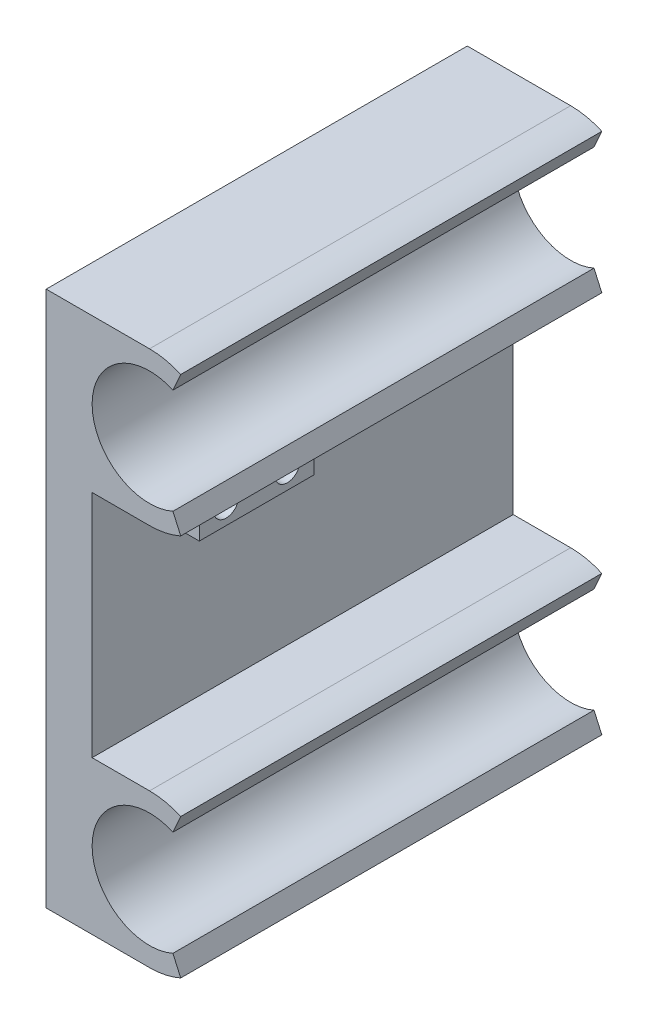
ISO-10303-21;
HEADER;
FILE_DESCRIPTION(('STEP AP214'),'2;1');
FILE_NAME('part.step','',(''),(''),'','','');
FILE_SCHEMA(('AUTOMOTIVE_DESIGN { 1 0 10303 214 1 1 1 1 }'));
ENDSEC;
DATA;
#1=APPLICATION_CONTEXT('core data for automotive mechanical design processes');
#2=APPLICATION_PROTOCOL_DEFINITION('international standard','automotive_design',2000,#1);
#3=PRODUCT_CONTEXT('',#1,'mechanical');
#4=PRODUCT('Part','Part','',(#3));
#5=PRODUCT_RELATED_PRODUCT_CATEGORY('part','',(#4));
#6=PRODUCT_DEFINITION_FORMATION('','',#4);
#7=PRODUCT_DEFINITION_CONTEXT('part definition',#1,'design');
#8=PRODUCT_DEFINITION('design','',#6,#7);
#9=PRODUCT_DEFINITION_SHAPE('','',#8);
#10=(LENGTH_UNIT() NAMED_UNIT(*) SI_UNIT(.MILLI.,.METRE.));
#11=(NAMED_UNIT(*) PLANE_ANGLE_UNIT() SI_UNIT($,.RADIAN.));
#12=(NAMED_UNIT(*) SI_UNIT($,.STERADIAN.) SOLID_ANGLE_UNIT());
#13=UNCERTAINTY_MEASURE_WITH_UNIT(LENGTH_MEASURE(1.E-05),#10,'distance_accuracy_value','');
#14=(GEOMETRIC_REPRESENTATION_CONTEXT(3) GLOBAL_UNCERTAINTY_ASSIGNED_CONTEXT((#13)) GLOBAL_UNIT_ASSIGNED_CONTEXT((#10,
#11,#12)) REPRESENTATION_CONTEXT('',''));
#15=CARTESIAN_POINT('',(0.,0.,0.));
#16=DIRECTION('',(0.,0.,1.));
#17=DIRECTION('',(1.,0.,0.));
#18=AXIS2_PLACEMENT_3D('',#15,#16,#17);
#19=CARTESIAN_POINT('',(6.,-15.,55.));
#20=DIRECTION('',(-1.,0.,0.));
#21=DIRECTION('',(0.,0.,1.));
#22=AXIS2_PLACEMENT_3D('',#19,#20,#21);
#23=PLANE('',#22);
#24=DIRECTION('',(0.,0.,-1.));
#25=VECTOR('',#24,1.);
#26=CARTESIAN_POINT('',(6.,15.,55.));
#27=LINE('',#26,#25);
#28=CARTESIAN_POINT('',(6.,15.,41.15));
#29=VERTEX_POINT('',#28);
#30=CARTESIAN_POINT('',(6.,15.,37.85));
#31=VERTEX_POINT('',#30);
#32=EDGE_CURVE('E462',#29,#31,#27,.T.);
#33=ORIENTED_EDGE('',*,*,#32,.F.);
#34=CARTESIAN_POINT('',(6.,15.,39.5));
#35=DIRECTION('',(1.,0.,0.));
#36=DIRECTION('',(0.,0.,-1.));
#37=AXIS2_PLACEMENT_3D('',#34,#35,#36);
#38=CIRCLE('',#37,1.65);
#39=EDGE_CURVE('E451',#29,#31,#38,.T.);
#40=ORIENTED_EDGE('',*,*,#39,.T.);
#41=EDGE_LOOP('',(#33,#40));
#42=FACE_BOUND('',#41,.T.);
#43=ADVANCED_FACE('F32',(#42),#23,.F.);
#44=CARTESIAN_POINT('',(6.,15.,49.15));
#45=VERTEX_POINT('',#44);
#46=CARTESIAN_POINT('',(6.,15.,45.85));
#47=VERTEX_POINT('',#46);
#48=EDGE_CURVE('E233',#45,#47,#27,.T.);
#49=ORIENTED_EDGE('',*,*,#48,.F.);
#50=CARTESIAN_POINT('',(6.,15.,47.5));
#51=DIRECTION('',(1.,0.,0.));
#52=DIRECTION('',(0.,0.,-1.));
#53=AXIS2_PLACEMENT_3D('',#50,#51,#52);
#54=CIRCLE('',#53,1.65);
#55=EDGE_CURVE('E475',#45,#47,#54,.T.);
#56=ORIENTED_EDGE('',*,*,#55,.T.);
#57=EDGE_LOOP('',(#49,#56));
#58=FACE_BOUND('',#57,.T.);
#59=ADVANCED_FACE('F474',(#58),#23,.F.);
#60=CARTESIAN_POINT('',(13.5,15.,55.));
#61=DIRECTION('',(0.,1.,0.));
#62=DIRECTION('',(-1.,0.,0.));
#63=AXIS2_PLACEMENT_3D('',#60,#61,#62);
#64=PLANE('',#63);
#65=DIRECTION('',(-1.,0.,0.));
#66=VECTOR('',#65,1.);
#67=CARTESIAN_POINT('',(13.5,15.,51.));
#68=LINE('',#67,#66);
#69=CARTESIAN_POINT('',(13.5,15.,51.));
#70=VERTEX_POINT('',#69);
#71=CARTESIAN_POINT('',(6.,15.,51.));
#72=VERTEX_POINT('',#71);
#73=EDGE_CURVE('E178',#70,#72,#68,.T.);
#74=ORIENTED_EDGE('',*,*,#73,.F.);
#75=DIRECTION('',(0.,0.,-1.));
#76=VECTOR('',#75,1.);
#77=CARTESIAN_POINT('',(13.5,15.,55.));
#78=LINE('',#77,#76);
#79=CARTESIAN_POINT('',(13.5,15.,55.));
#80=VERTEX_POINT('',#79);
#81=EDGE_CURVE('E175',#80,#70,#78,.T.);
#82=ORIENTED_EDGE('',*,*,#81,.F.);
#83=DIRECTION('',(1.,0.,0.));
#84=VECTOR('',#83,1.);
#85=CARTESIAN_POINT('',(13.5,15.,55.));
#86=LINE('',#85,#84);
#87=CARTESIAN_POINT('',(6.,15.,55.));
#88=VERTEX_POINT('',#87);
#89=EDGE_CURVE('E161',#88,#80,#86,.T.);
#90=ORIENTED_EDGE('',*,*,#89,.F.);
#91=EDGE_CURVE('E230',#88,#72,#27,.T.);
#92=ORIENTED_EDGE('',*,*,#91,.T.);
#93=EDGE_LOOP('',(#74,#82,#90,#92));
#94=FACE_BOUND('',#93,.T.);
#95=ADVANCED_FACE('F176',(#94),#64,.F.);
#96=DIRECTION('',(1.,0.,0.));
#97=VECTOR('',#96,1.);
#98=CARTESIAN_POINT('',(13.5,15.,36.));
#99=LINE('',#98,#97);
#100=CARTESIAN_POINT('',(6.,15.,36.));
#101=VERTEX_POINT('',#100);
#102=CARTESIAN_POINT('',(13.5,15.,36.));
#103=VERTEX_POINT('',#102);
#104=EDGE_CURVE('E412',#101,#103,#99,.T.);
#105=ORIENTED_EDGE('',*,*,#104,.F.);
#106=CARTESIAN_POINT('',(6.,15.,0.));
#107=VERTEX_POINT('',#106);
#108=EDGE_CURVE('E181',#101,#107,#27,.T.);
#109=ORIENTED_EDGE('',*,*,#108,.T.);
#110=DIRECTION('',(1.,0.,0.));
#111=VECTOR('',#110,1.);
#112=CARTESIAN_POINT('',(13.5,15.,0.));
#113=LINE('',#112,#111);
#114=CARTESIAN_POINT('',(13.5,15.,0.));
#115=VERTEX_POINT('',#114);
#116=EDGE_CURVE('E221',#107,#115,#113,.T.);
#117=ORIENTED_EDGE('',*,*,#116,.T.);
#118=EDGE_CURVE('E184',#103,#115,#78,.T.);
#119=ORIENTED_EDGE('',*,*,#118,.F.);
#120=EDGE_LOOP('',(#105,#109,#117,#119));
#121=FACE_BOUND('',#120,.T.);
#122=ADVANCED_FACE('F460',(#121),#64,.F.);
#123=ORIENTED_EDGE('',*,*,#32,.T.);
#124=DIRECTION('',(-1.,0.,0.));
#125=VECTOR('',#124,1.);
#126=CARTESIAN_POINT('',(16.,15.,37.85));
#127=LINE('',#126,#125);
#128=CARTESIAN_POINT('',(13.5,15.,37.85));
#129=VERTEX_POINT('',#128);
#130=EDGE_CURVE('E409',#31,#129,#127,.F.);
#131=ORIENTED_EDGE('',*,*,#130,.T.);
#132=CARTESIAN_POINT('',(13.5,15.,41.15));
#133=VERTEX_POINT('',#132);
#134=EDGE_CURVE('E486',#133,#129,#78,.T.);
#135=ORIENTED_EDGE('',*,*,#134,.F.);
#136=DIRECTION('',(-1.,0.,0.));
#137=VECTOR('',#136,1.);
#138=CARTESIAN_POINT('',(16.,15.,41.15));
#139=LINE('',#138,#137);
#140=EDGE_CURVE('E406',#133,#29,#139,.T.);
#141=ORIENTED_EDGE('',*,*,#140,.T.);
#142=EDGE_LOOP('',(#123,#131,#135,#141));
#143=FACE_BOUND('',#142,.T.);
#144=ADVANCED_FACE('F485',(#143),#64,.F.);
#145=CARTESIAN_POINT('',(13.5,25.,55.));
#146=DIRECTION('',(0.,0.,-1.));
#147=DIRECTION('',(-1.,0.,0.));
#148=AXIS2_PLACEMENT_3D('',#145,#146,#147);
#149=CYLINDRICAL_SURFACE('',#148,10.);
#150=CARTESIAN_POINT('',(13.5,25.,36.));
#151=DIRECTION('',(0.,0.,1.));
#152=DIRECTION('',(1.,0.,0.));
#153=AXIS2_PLACEMENT_3D('',#150,#151,#152);
#154=CIRCLE('',#153,10.);
#155=CARTESIAN_POINT('',(16.,15.3175416344815,36.));
#156=VERTEX_POINT('',#155);
#157=EDGE_CURVE('E11',#103,#156,#154,.T.);
#158=ORIENTED_EDGE('',*,*,#157,.F.);
#159=ORIENTED_EDGE('',*,*,#118,.T.);
#160=CARTESIAN_POINT('',(13.5,25.,0.));
#161=DIRECTION('',(0.,0.,1.));
#162=DIRECTION('',(1.,0.,0.));
#163=AXIS2_PLACEMENT_3D('',#160,#161,#162);
#164=CIRCLE('',#163,10.);
#165=CARTESIAN_POINT('',(17.5721274810868,15.8666666666667,0.));
#166=VERTEX_POINT('',#165);
#167=EDGE_CURVE('E224',#115,#166,#164,.T.);
#168=ORIENTED_EDGE('',*,*,#167,.T.);
#169=DIRECTION('',(0.,0.,-1.));
#170=VECTOR('',#169,1.);
#171=CARTESIAN_POINT('',(17.5721274810868,15.8666666666667,55.));
#172=LINE('',#171,#170);
#173=CARTESIAN_POINT('',(17.5721274810868,15.8666666666667,55.));
#174=VERTEX_POINT('',#173);
#175=EDGE_CURVE('E187',#174,#166,#172,.T.);
#176=ORIENTED_EDGE('',*,*,#175,.F.);
#177=CARTESIAN_POINT('',(13.5,25.,55.));
#178=DIRECTION('',(0.,0.,1.));
#179=DIRECTION('',(1.,0.,0.));
#180=AXIS2_PLACEMENT_3D('',#177,#178,#179);
#181=CIRCLE('',#180,10.);
#182=EDGE_CURVE('E165',#80,#174,#181,.T.);
#183=ORIENTED_EDGE('',*,*,#182,.F.);
#184=ORIENTED_EDGE('',*,*,#81,.T.);
#185=CARTESIAN_POINT('',(13.5,25.,51.));
#186=DIRECTION('',(0.,0.,-1.));
#187=DIRECTION('',(-1.,0.,0.));
#188=AXIS2_PLACEMENT_3D('',#185,#186,#187);
#189=CIRCLE('',#188,10.);
#190=CARTESIAN_POINT('',(16.,15.3175416344815,51.));
#191=VERTEX_POINT('',#190);
#192=EDGE_CURVE('E299',#191,#70,#189,.T.);
#193=ORIENTED_EDGE('',*,*,#192,.F.);
#194=DIRECTION('',(0.,0.,-1.));
#195=VECTOR('',#194,1.);
#196=CARTESIAN_POINT('',(16.,15.3175416344815,55.));
#197=LINE('',#196,#195);
#198=CARTESIAN_POINT('',(16.,15.3175416344815,49.1191563576044));
#199=VERTEX_POINT('',#198);
#200=EDGE_CURVE('E276',#199,#191,#197,.F.);
#201=ORIENTED_EDGE('',*,*,#200,.F.);
#202=CARTESIAN_POINT('',(16.,15.3175416344815,49.1191563576044));
#203=CARTESIAN_POINT('',(15.8979421307727,15.2911890542514,49.124310786379));
#204=CARTESIAN_POINT('',(15.795428287766,15.2664425788042,49.1285095422768));
#205=CARTESIAN_POINT('',(15.589630059372,15.2201962731603,49.135411814873));
#206=CARTESIAN_POINT('',(15.4863457474233,15.1986961375799,49.1381154722793));
#207=CARTESIAN_POINT('',(15.2795529573279,15.1590533011292,49.142435605293));
#208=CARTESIAN_POINT('',(15.1760471286741,15.1408972134226,49.1440564871295));
#209=CARTESIAN_POINT('',(14.9685037598624,15.1078547321028,49.1465547736602));
#210=CARTESIAN_POINT('',(14.8644662064941,15.0929684201337,49.1474321597914));
#211=CARTESIAN_POINT('',(14.6559752365499,15.0664828240433,49.1487133619864));
#212=CARTESIAN_POINT('',(14.5515218366008,15.054883409814,49.1491171967972));
#213=CARTESIAN_POINT('',(14.342301705926,15.0349826782866,49.1496589529621));
#214=CARTESIAN_POINT('',(14.2375349779505,15.0266813321254,49.1497968766433));
#215=CARTESIAN_POINT('',(14.0273608233567,15.0133577763454,49.1499602200339));
#216=CARTESIAN_POINT('',(13.9219525331465,15.0083491834372,49.1499851750482));
#217=CARTESIAN_POINT('',(13.7110294926947,15.0016699822797,49.1499996152529));
#218=CARTESIAN_POINT('',(13.6055147416964,14.9999993979307,49.1499891001893));
#219=CARTESIAN_POINT('',(13.5,15.,49.15));
#220=B_SPLINE_CURVE_WITH_KNOTS('',3,(#202,#203,#204,#205,#206,#207,#208,#209,#210,#211,#212,
#213,#214,#215,#216,#217,#218,#219),.UNSPECIFIED.,.F.,.F.,(4,2,2,2,2,2,2,2,4),(0.,
0.316566485829993,0.63310317361785,0.948343775264132,1.26359224735279,1.57882823894681,
1.89406147167617,2.2105902406735,2.52712127602648),.UNSPECIFIED.);
#221=CARTESIAN_POINT('',(13.5,15.,49.15));
#222=VERTEX_POINT('',#221);
#223=EDGE_CURVE('E268',#199,#222,#220,.T.);
#224=ORIENTED_EDGE('',*,*,#223,.T.);
#225=CARTESIAN_POINT('',(13.5,15.,45.85));
#226=VERTEX_POINT('',#225);
#227=EDGE_CURVE('E182',#222,#226,#78,.T.);
#228=ORIENTED_EDGE('',*,*,#227,.T.);
#229=CARTESIAN_POINT('',(13.5,15.,45.85));
#230=CARTESIAN_POINT('',(13.6055147416964,14.9999993979307,45.8500108998107));
#231=CARTESIAN_POINT('',(13.7110294926947,15.0016699822797,45.8500003847472));
#232=CARTESIAN_POINT('',(13.9219525331465,15.0083491834372,45.8500148249519));
#233=CARTESIAN_POINT('',(14.0273608233567,15.0133577763454,45.8500397799661));
#234=CARTESIAN_POINT('',(14.2375349779505,15.0266813321254,45.8502031233567));
#235=CARTESIAN_POINT('',(14.342301705926,15.0349826782866,45.8503410470379));
#236=CARTESIAN_POINT('',(14.5515218366008,15.054883409814,45.8508828032028));
#237=CARTESIAN_POINT('',(14.6559752365499,15.0664828240433,45.8512866380136));
#238=CARTESIAN_POINT('',(14.8644662064941,15.0929684201337,45.8525678402087));
#239=CARTESIAN_POINT('',(14.9685037598624,15.1078547321028,45.8534452263399));
#240=CARTESIAN_POINT('',(15.1760471286741,15.1408972134226,45.8559435128705));
#241=CARTESIAN_POINT('',(15.2795529573279,15.1590533011292,45.857564394707));
#242=CARTESIAN_POINT('',(15.4863457474233,15.1986961375799,45.8618845277208));
#243=CARTESIAN_POINT('',(15.589630059372,15.2201962731603,45.864588185127));
#244=CARTESIAN_POINT('',(15.795428287766,15.2664425788042,45.8714904577232));
#245=CARTESIAN_POINT('',(15.8979421307727,15.2911890542514,45.875689213621));
#246=CARTESIAN_POINT('',(16.,15.3175416344815,45.8808436423956));
#247=B_SPLINE_CURVE_WITH_KNOTS('',3,(#229,#230,#231,#232,#233,#234,#235,#236,#237,#238,#239,
#240,#241,#242,#243,#244,#245,#246),.UNSPECIFIED.,.F.,.F.,(4,2,2,2,2,2,2,2,4),(0.,
0.316531035352973,0.633059804350308,0.948293037079668,1.26352902867369,1.57877750076235,
1.89401810240863,2.21055479019649,2.52712127602648),.UNSPECIFIED.);
#248=CARTESIAN_POINT('',(16.,15.3175416344815,45.8808436423956));
#249=VERTEX_POINT('',#248);
#250=EDGE_CURVE('E291',#226,#249,#247,.T.);
#251=ORIENTED_EDGE('',*,*,#250,.T.);
#252=CARTESIAN_POINT('',(16.,15.3175416344815,41.1191563576044));
#253=VERTEX_POINT('',#252);
#254=EDGE_CURVE('E298',#253,#249,#197,.F.);
#255=ORIENTED_EDGE('',*,*,#254,.F.);
#256=CARTESIAN_POINT('',(16.,15.3175416344815,41.1191563576044));
#257=CARTESIAN_POINT('',(15.8979421307727,15.2911890542514,41.124310786379));
#258=CARTESIAN_POINT('',(15.795428287766,15.2664425788042,41.1285095422768));
#259=CARTESIAN_POINT('',(15.589630059372,15.2201962731603,41.135411814873));
#260=CARTESIAN_POINT('',(15.4863457474233,15.1986961375799,41.1381154722793));
#261=CARTESIAN_POINT('',(15.2795529573279,15.1590533011292,41.142435605293));
#262=CARTESIAN_POINT('',(15.1760471286741,15.1408972134226,41.1440564871295));
#263=CARTESIAN_POINT('',(14.9685037598624,15.1078547321028,41.1465547736602));
#264=CARTESIAN_POINT('',(14.8644662064941,15.0929684201337,41.1474321597914));
#265=CARTESIAN_POINT('',(14.6559752365499,15.0664828240433,41.1487133619864));
#266=CARTESIAN_POINT('',(14.5515218366008,15.054883409814,41.1491171967972));
#267=CARTESIAN_POINT('',(14.342301705926,15.0349826782866,41.1496589529621));
#268=CARTESIAN_POINT('',(14.2375349779505,15.0266813321254,41.1497968766433));
#269=CARTESIAN_POINT('',(14.0273608233567,15.0133577763454,41.1499602200339));
#270=CARTESIAN_POINT('',(13.9219525331465,15.0083491834372,41.1499851750482));
#271=CARTESIAN_POINT('',(13.7110294926947,15.0016699822797,41.1499996152529));
#272=CARTESIAN_POINT('',(13.6055147416964,14.9999993979307,41.1499891001893));
#273=CARTESIAN_POINT('',(13.5,15.,41.15));
#274=B_SPLINE_CURVE_WITH_KNOTS('',3,(#256,#257,#258,#259,#260,#261,#262,#263,#264,#265,#266,
#267,#268,#269,#270,#271,#272,#273),.UNSPECIFIED.,.F.,.F.,(4,2,2,2,2,2,2,2,4),(0.,
0.316566485829993,0.633103173617851,0.948343775264132,1.26359224735279,1.57882823894681,
1.89406147167617,2.2105902406735,2.52712127602648),.UNSPECIFIED.);
#275=EDGE_CURVE('E300',#253,#133,#274,.T.);
#276=ORIENTED_EDGE('',*,*,#275,.T.);
#277=ORIENTED_EDGE('',*,*,#134,.T.);
#278=CARTESIAN_POINT('',(13.5,15.,37.85));
#279=CARTESIAN_POINT('',(13.6055147416964,14.9999993979307,37.8500108998107));
#280=CARTESIAN_POINT('',(13.7110294926947,15.0016699822797,37.8500003847472));
#281=CARTESIAN_POINT('',(13.9219525331465,15.0083491834372,37.8500148249519));
#282=CARTESIAN_POINT('',(14.0273608233567,15.0133577763454,37.8500397799661));
#283=CARTESIAN_POINT('',(14.2375349779505,15.0266813321254,37.8502031233567));
#284=CARTESIAN_POINT('',(14.342301705926,15.0349826782866,37.8503410470379));
#285=CARTESIAN_POINT('',(14.5515218366008,15.054883409814,37.8508828032028));
#286=CARTESIAN_POINT('',(14.6559752365499,15.0664828240433,37.8512866380136));
#287=CARTESIAN_POINT('',(14.8644662064941,15.0929684201337,37.8525678402087));
#288=CARTESIAN_POINT('',(14.9685037598624,15.1078547321028,37.8534452263399));
#289=CARTESIAN_POINT('',(15.1760471286741,15.1408972134226,37.8559435128705));
#290=CARTESIAN_POINT('',(15.2795529573279,15.1590533011292,37.857564394707));
#291=CARTESIAN_POINT('',(15.4863457474233,15.1986961375799,37.8618845277208));
#292=CARTESIAN_POINT('',(15.589630059372,15.2201962731603,37.864588185127));
#293=CARTESIAN_POINT('',(15.795428287766,15.2664425788042,37.8714904577232));
#294=CARTESIAN_POINT('',(15.8979421307727,15.2911890542514,37.8756892136211));
#295=CARTESIAN_POINT('',(16.,15.3175416344815,37.8808436423956));
#296=B_SPLINE_CURVE_WITH_KNOTS('',3,(#278,#279,#280,#281,#282,#283,#284,#285,#286,#287,#288,
#289,#290,#291,#292,#293,#294,#295),.UNSPECIFIED.,.F.,.F.,(4,2,2,2,2,2,2,2,4),(0.,
0.316531035352973,0.633059804350308,0.948293037079668,1.26352902867369,1.57877750076235,
1.89401810240863,2.21055479019649,2.52712127602648),.UNSPECIFIED.);
#297=CARTESIAN_POINT('',(16.,15.3175416344815,37.8808436423956));
#298=VERTEX_POINT('',#297);
#299=EDGE_CURVE('E306',#129,#298,#296,.T.);
#300=ORIENTED_EDGE('',*,*,#299,.T.);
#301=EDGE_CURVE('E40',#156,#298,#197,.F.);
#302=ORIENTED_EDGE('',*,*,#301,.F.);
#303=EDGE_LOOP('',(#158,#159,#168,#176,#183,#184,#193,#201,#224,#228,#251,#255,#276,#277,#300,#302));
#304=FACE_BOUND('',#303,.T.);
#305=ADVANCED_FACE('F186',(#304),#149,.T.);
#306=CARTESIAN_POINT('',(13.5,25.,55.));
#307=DIRECTION('',(0.,0.,-1.));
#308=DIRECTION('',(-1.,0.,0.));
#309=AXIS2_PLACEMENT_3D('',#306,#307,#308);
#310=CYLINDRICAL_SURFACE('',#309,7.5);
#311=CARTESIAN_POINT('',(13.5,25.,0.));
#312=DIRECTION('',(0.,0.,-1.));
#313=DIRECTION('',(1.,0.,0.));
#314=AXIS2_PLACEMENT_3D('',#311,#312,#313);
#315=CIRCLE('',#314,7.5);
#316=CARTESIAN_POINT('',(16.5540956108151,18.15,0.));
#317=VERTEX_POINT('',#316);
#318=CARTESIAN_POINT('',(16.5540956108151,31.85,0.));
#319=VERTEX_POINT('',#318);
#320=EDGE_CURVE('E193',#317,#319,#315,.T.);
#321=ORIENTED_EDGE('',*,*,#320,.T.);
#322=DIRECTION('',(0.,0.,-1.));
#323=VECTOR('',#322,1.);
#324=CARTESIAN_POINT('',(16.5540956108151,31.85,55.));
#325=LINE('',#324,#323);
#326=CARTESIAN_POINT('',(16.5540956108151,31.85,55.));
#327=VERTEX_POINT('',#326);
#328=EDGE_CURVE('E266',#327,#319,#325,.T.);
#329=ORIENTED_EDGE('',*,*,#328,.F.);
#330=CARTESIAN_POINT('',(13.5,25.,55.));
#331=DIRECTION('',(0.,0.,-1.));
#332=DIRECTION('',(1.,0.,0.));
#333=AXIS2_PLACEMENT_3D('',#330,#331,#332);
#334=CIRCLE('',#333,7.5);
#335=CARTESIAN_POINT('',(16.5540956108151,18.15,55.));
#336=VERTEX_POINT('',#335);
#337=EDGE_CURVE('E227',#336,#327,#334,.T.);
#338=ORIENTED_EDGE('',*,*,#337,.F.);
#339=DIRECTION('',(0.,0.,-1.));
#340=VECTOR('',#339,1.);
#341=CARTESIAN_POINT('',(16.5540956108151,18.15,55.));
#342=LINE('',#341,#340);
#343=EDGE_CURVE('E189',#336,#317,#342,.T.);
#344=ORIENTED_EDGE('',*,*,#343,.T.);
#345=EDGE_LOOP('',(#321,#329,#338,#344));
#346=FACE_BOUND('',#345,.T.);
#347=ADVANCED_FACE('F34',(#346),#310,.F.);
#348=CARTESIAN_POINT('',(16.5540956108151,31.85,55.));
#349=DIRECTION('',(-0.913333333333332,0.407212748108682,0.));
#350=DIRECTION('',(-0.407212748108682,-0.913333333333332,0.));
#351=AXIS2_PLACEMENT_3D('',#348,#349,#350);
#352=PLANE('',#351);
#353=DIRECTION('',(0.407212748108682,0.913333333333332,0.));
#354=VECTOR('',#353,1.);
#355=CARTESIAN_POINT('',(16.5540956108151,31.85,0.));
#356=LINE('',#355,#354);
#357=CARTESIAN_POINT('',(17.5721274810868,34.1333333333333,0.));
#358=VERTEX_POINT('',#357);
#359=EDGE_CURVE('E196',#319,#358,#356,.T.);
#360=ORIENTED_EDGE('',*,*,#359,.T.);
#361=DIRECTION('',(0.,0.,-1.));
#362=VECTOR('',#361,1.);
#363=CARTESIAN_POINT('',(17.5721274810868,34.1333333333333,55.));
#364=LINE('',#363,#362);
#365=CARTESIAN_POINT('',(17.5721274810868,34.1333333333333,55.));
#366=VERTEX_POINT('',#365);
#367=EDGE_CURVE('E263',#366,#358,#364,.T.);
#368=ORIENTED_EDGE('',*,*,#367,.F.);
#369=DIRECTION('',(0.407212748108682,0.913333333333332,0.));
#370=VECTOR('',#369,1.);
#371=CARTESIAN_POINT('',(16.5540956108151,31.85,55.));
#372=LINE('',#371,#370);
#373=EDGE_CURVE('E122',#327,#366,#372,.T.);
#374=ORIENTED_EDGE('',*,*,#373,.F.);
#375=ORIENTED_EDGE('',*,*,#328,.T.);
#376=EDGE_LOOP('',(#360,#368,#374,#375));
#377=FACE_BOUND('',#376,.T.);
#378=ADVANCED_FACE('F550',(#377),#352,.F.);
#379=CARTESIAN_POINT('',(13.5,25.,55.));
#380=DIRECTION('',(0.,0.,-1.));
#381=DIRECTION('',(-1.,0.,0.));
#382=AXIS2_PLACEMENT_3D('',#379,#380,#381);
#383=CYLINDRICAL_SURFACE('',#382,10.);
#384=CARTESIAN_POINT('',(13.5,25.,0.));
#385=DIRECTION('',(0.,0.,1.));
#386=DIRECTION('',(1.,0.,0.));
#387=AXIS2_PLACEMENT_3D('',#384,#385,#386);
#388=CIRCLE('',#387,10.);
#389=CARTESIAN_POINT('',(13.5,35.,0.));
#390=VERTEX_POINT('',#389);
#391=EDGE_CURVE('E198',#358,#390,#388,.T.);
#392=ORIENTED_EDGE('',*,*,#391,.T.);
#393=DIRECTION('',(0.,0.,-1.));
#394=VECTOR('',#393,1.);
#395=CARTESIAN_POINT('',(13.5,35.,55.));
#396=LINE('',#395,#394);
#397=CARTESIAN_POINT('',(13.5,35.,55.));
#398=VERTEX_POINT('',#397);
#399=EDGE_CURVE('E260',#398,#390,#396,.T.);
#400=ORIENTED_EDGE('',*,*,#399,.F.);
#401=CARTESIAN_POINT('',(13.5,25.,55.));
#402=DIRECTION('',(0.,0.,1.));
#403=DIRECTION('',(1.,0.,0.));
#404=AXIS2_PLACEMENT_3D('',#401,#402,#403);
#405=CIRCLE('',#404,10.);
#406=EDGE_CURVE('E417',#366,#398,#405,.T.);
#407=ORIENTED_EDGE('',*,*,#406,.F.);
#408=ORIENTED_EDGE('',*,*,#367,.T.);
#409=EDGE_LOOP('',(#392,#400,#407,#408));
#410=FACE_BOUND('',#409,.T.);
#411=ADVANCED_FACE('F547',(#410),#383,.T.);
#412=CARTESIAN_POINT('',(13.5,35.,55.));
#413=DIRECTION('',(0.,-1.,0.));
#414=DIRECTION('',(0.,0.,-1.));
#415=AXIS2_PLACEMENT_3D('',#412,#413,#414);
#416=PLANE('',#415);
#417=DIRECTION('',(-1.,0.,0.));
#418=VECTOR('',#417,1.);
#419=CARTESIAN_POINT('',(13.5,35.,0.));
#420=LINE('',#419,#418);
#421=CARTESIAN_POINT('',(0.,35.,0.));
#422=VERTEX_POINT('',#421);
#423=EDGE_CURVE('E200',#390,#422,#420,.T.);
#424=ORIENTED_EDGE('',*,*,#423,.T.);
#425=DIRECTION('',(0.,0.,-1.));
#426=VECTOR('',#425,1.);
#427=CARTESIAN_POINT('',(0.,35.,55.));
#428=LINE('',#427,#426);
#429=CARTESIAN_POINT('',(0.,35.,55.));
#430=VERTEX_POINT('',#429);
#431=EDGE_CURVE('E257',#430,#422,#428,.T.);
#432=ORIENTED_EDGE('',*,*,#431,.F.);
#433=DIRECTION('',(-1.,0.,0.));
#434=VECTOR('',#433,1.);
#435=CARTESIAN_POINT('',(13.5,35.,55.));
#436=LINE('',#435,#434);
#437=EDGE_CURVE('E419',#398,#430,#436,.T.);
#438=ORIENTED_EDGE('',*,*,#437,.F.);
#439=ORIENTED_EDGE('',*,*,#399,.T.);
#440=EDGE_LOOP('',(#424,#432,#438,#439));
#441=FACE_BOUND('',#440,.T.);
#442=ADVANCED_FACE('F543',(#441),#416,.F.);
#443=CARTESIAN_POINT('',(0.,35.,55.));
#444=DIRECTION('',(1.,0.,0.));
#445=DIRECTION('',(0.,0.,-1.));
#446=AXIS2_PLACEMENT_3D('',#443,#444,#445);
#447=PLANE('',#446);
#448=DIRECTION('',(0.,-1.,0.));
#449=VECTOR('',#448,1.);
#450=CARTESIAN_POINT('',(0.,35.,0.));
#451=LINE('',#450,#449);
#452=CARTESIAN_POINT('',(0.,-35.,0.));
#453=VERTEX_POINT('',#452);
#454=EDGE_CURVE('E202',#422,#453,#451,.T.);
#455=ORIENTED_EDGE('',*,*,#454,.T.);
#456=DIRECTION('',(0.,0.,-1.));
#457=VECTOR('',#456,1.);
#458=CARTESIAN_POINT('',(0.,-35.,55.));
#459=LINE('',#458,#457);
#460=CARTESIAN_POINT('',(0.,-35.,55.));
#461=VERTEX_POINT('',#460);
#462=EDGE_CURVE('E254',#461,#453,#459,.T.);
#463=ORIENTED_EDGE('',*,*,#462,.F.);
#464=DIRECTION('',(0.,-1.,0.));
#465=VECTOR('',#464,1.);
#466=CARTESIAN_POINT('',(0.,35.,55.));
#467=LINE('',#466,#465);
#468=EDGE_CURVE('E421',#430,#461,#467,.T.);
#469=ORIENTED_EDGE('',*,*,#468,.F.);
#470=ORIENTED_EDGE('',*,*,#431,.T.);
#471=EDGE_LOOP('',(#455,#463,#469,#470));
#472=FACE_BOUND('',#471,.T.);
#473=ADVANCED_FACE('F539',(#472),#447,.F.);
#474=CARTESIAN_POINT('',(13.5,-35.,55.));
#475=DIRECTION('',(0.,1.,0.));
#476=DIRECTION('',(0.,0.,1.));
#477=AXIS2_PLACEMENT_3D('',#474,#475,#476);
#478=PLANE('',#477);
#479=DIRECTION('',(1.,0.,0.));
#480=VECTOR('',#479,1.);
#481=CARTESIAN_POINT('',(13.5,-35.,0.));
#482=LINE('',#481,#480);
#483=CARTESIAN_POINT('',(13.5,-35.,0.));
#484=VERTEX_POINT('',#483);
#485=EDGE_CURVE('E204',#453,#484,#482,.T.);
#486=ORIENTED_EDGE('',*,*,#485,.T.);
#487=DIRECTION('',(0.,0.,-1.));
#488=VECTOR('',#487,1.);
#489=CARTESIAN_POINT('',(13.5,-35.,55.));
#490=LINE('',#489,#488);
#491=CARTESIAN_POINT('',(13.5,-35.,55.));
#492=VERTEX_POINT('',#491);
#493=EDGE_CURVE('E251',#492,#484,#490,.T.);
#494=ORIENTED_EDGE('',*,*,#493,.F.);
#495=DIRECTION('',(1.,0.,0.));
#496=VECTOR('',#495,1.);
#497=CARTESIAN_POINT('',(13.5,-35.,55.));
#498=LINE('',#497,#496);
#499=EDGE_CURVE('E423',#461,#492,#498,.T.);
#500=ORIENTED_EDGE('',*,*,#499,.F.);
#501=ORIENTED_EDGE('',*,*,#462,.T.);
#502=EDGE_LOOP('',(#486,#494,#500,#501));
#503=FACE_BOUND('',#502,.T.);
#504=ADVANCED_FACE('F535',(#503),#478,.F.);
#505=CARTESIAN_POINT('',(13.5,-25.,55.));
#506=DIRECTION('',(0.,0.,-1.));
#507=DIRECTION('',(-1.,0.,0.));
#508=AXIS2_PLACEMENT_3D('',#505,#506,#507);
#509=CYLINDRICAL_SURFACE('',#508,10.);
#510=CARTESIAN_POINT('',(13.5,-25.,0.));
#511=DIRECTION('',(0.,0.,1.));
#512=DIRECTION('',(-1.,0.,0.));
#513=AXIS2_PLACEMENT_3D('',#510,#511,#512);
#514=CIRCLE('',#513,10.);
#515=CARTESIAN_POINT('',(17.5721274810868,-34.1333333333333,0.));
#516=VERTEX_POINT('',#515);
#517=EDGE_CURVE('E206',#484,#516,#514,.T.);
#518=ORIENTED_EDGE('',*,*,#517,.T.);
#519=DIRECTION('',(0.,0.,-1.));
#520=VECTOR('',#519,1.);
#521=CARTESIAN_POINT('',(17.5721274810868,-34.1333333333333,55.));
#522=LINE('',#521,#520);
#523=CARTESIAN_POINT('',(17.5721274810868,-34.1333333333333,55.));
#524=VERTEX_POINT('',#523);
#525=EDGE_CURVE('E248',#524,#516,#522,.T.);
#526=ORIENTED_EDGE('',*,*,#525,.F.);
#527=CARTESIAN_POINT('',(13.5,-25.,55.));
#528=DIRECTION('',(0.,0.,1.));
#529=DIRECTION('',(-1.,0.,0.));
#530=AXIS2_PLACEMENT_3D('',#527,#528,#529);
#531=CIRCLE('',#530,10.);
#532=EDGE_CURVE('E425',#492,#524,#531,.T.);
#533=ORIENTED_EDGE('',*,*,#532,.F.);
#534=ORIENTED_EDGE('',*,*,#493,.T.);
#535=EDGE_LOOP('',(#518,#526,#533,#534));
#536=FACE_BOUND('',#535,.T.);
#537=ADVANCED_FACE('F531',(#536),#509,.T.);
#538=CARTESIAN_POINT('',(16.5540956108151,-31.85,55.));
#539=DIRECTION('',(-0.913333333333332,-0.407212748108682,0.));
#540=DIRECTION('',(0.407212748108682,-0.913333333333332,0.));
#541=AXIS2_PLACEMENT_3D('',#538,#539,#540);
#542=PLANE('',#541);
#543=DIRECTION('',(-0.407212748108682,0.913333333333332,0.));
#544=VECTOR('',#543,1.);
#545=CARTESIAN_POINT('',(16.5540956108151,-31.85,0.));
#546=LINE('',#545,#544);
#547=CARTESIAN_POINT('',(16.5540956108151,-31.85,0.));
#548=VERTEX_POINT('',#547);
#549=EDGE_CURVE('E208',#516,#548,#546,.T.);
#550=ORIENTED_EDGE('',*,*,#549,.T.);
#551=DIRECTION('',(0.,0.,-1.));
#552=VECTOR('',#551,1.);
#553=CARTESIAN_POINT('',(16.5540956108151,-31.85,55.));
#554=LINE('',#553,#552);
#555=CARTESIAN_POINT('',(16.5540956108151,-31.85,55.));
#556=VERTEX_POINT('',#555);
#557=EDGE_CURVE('E245',#556,#548,#554,.T.);
#558=ORIENTED_EDGE('',*,*,#557,.F.);
#559=DIRECTION('',(-0.407212748108682,0.913333333333332,0.));
#560=VECTOR('',#559,1.);
#561=CARTESIAN_POINT('',(16.5540956108151,-31.85,55.));
#562=LINE('',#561,#560);
#563=EDGE_CURVE('E427',#524,#556,#562,.T.);
#564=ORIENTED_EDGE('',*,*,#563,.F.);
#565=ORIENTED_EDGE('',*,*,#525,.T.);
#566=EDGE_LOOP('',(#550,#558,#564,#565));
#567=FACE_BOUND('',#566,.T.);
#568=ADVANCED_FACE('F527',(#567),#542,.F.);
#569=CARTESIAN_POINT('',(13.5,-25.,55.));
#570=DIRECTION('',(0.,0.,-1.));
#571=DIRECTION('',(-1.,0.,0.));
#572=AXIS2_PLACEMENT_3D('',#569,#570,#571);
#573=CYLINDRICAL_SURFACE('',#572,7.5);
#574=CARTESIAN_POINT('',(13.5,-25.,0.));
#575=DIRECTION('',(0.,0.,-1.));
#576=DIRECTION('',(-1.,0.,0.));
#577=AXIS2_PLACEMENT_3D('',#574,#575,#576);
#578=CIRCLE('',#577,7.5);
#579=CARTESIAN_POINT('',(16.5540956108151,-18.15,0.));
#580=VERTEX_POINT('',#579);
#581=EDGE_CURVE('E210',#548,#580,#578,.T.);
#582=ORIENTED_EDGE('',*,*,#581,.T.);
#583=DIRECTION('',(0.,0.,-1.));
#584=VECTOR('',#583,1.);
#585=CARTESIAN_POINT('',(16.5540956108151,-18.15,55.));
#586=LINE('',#585,#584);
#587=CARTESIAN_POINT('',(16.5540956108151,-18.15,55.));
#588=VERTEX_POINT('',#587);
#589=EDGE_CURVE('E242',#588,#580,#586,.T.);
#590=ORIENTED_EDGE('',*,*,#589,.F.);
#591=CARTESIAN_POINT('',(13.5,-25.,55.));
#592=DIRECTION('',(0.,0.,-1.));
#593=DIRECTION('',(-1.,0.,0.));
#594=AXIS2_PLACEMENT_3D('',#591,#592,#593);
#595=CIRCLE('',#594,7.5);
#596=EDGE_CURVE('E429',#556,#588,#595,.T.);
#597=ORIENTED_EDGE('',*,*,#596,.F.);
#598=ORIENTED_EDGE('',*,*,#557,.T.);
#599=EDGE_LOOP('',(#582,#590,#597,#598));
#600=FACE_BOUND('',#599,.T.);
#601=ADVANCED_FACE('F523',(#600),#573,.F.);
#602=CARTESIAN_POINT('',(16.5540956108151,-18.15,55.));
#603=DIRECTION('',(-0.913333333333332,0.407212748108681,0.));
#604=DIRECTION('',(-0.407212748108681,-0.913333333333332,0.));
#605=AXIS2_PLACEMENT_3D('',#602,#603,#604);
#606=PLANE('',#605);
#607=DIRECTION('',(0.407212748108681,0.913333333333332,0.));
#608=VECTOR('',#607,1.);
#609=CARTESIAN_POINT('',(16.5540956108151,-18.15,0.));
#610=LINE('',#609,#608);
#611=CARTESIAN_POINT('',(17.5721274810868,-15.8666666666667,0.));
#612=VERTEX_POINT('',#611);
#613=EDGE_CURVE('E212',#580,#612,#610,.T.);
#614=ORIENTED_EDGE('',*,*,#613,.T.);
#615=DIRECTION('',(0.,0.,-1.));
#616=VECTOR('',#615,1.);
#617=CARTESIAN_POINT('',(17.5721274810868,-15.8666666666667,55.));
#618=LINE('',#617,#616);
#619=CARTESIAN_POINT('',(17.5721274810868,-15.8666666666667,55.));
#620=VERTEX_POINT('',#619);
#621=EDGE_CURVE('E239',#620,#612,#618,.T.);
#622=ORIENTED_EDGE('',*,*,#621,.F.);
#623=DIRECTION('',(0.407212748108681,0.913333333333332,0.));
#624=VECTOR('',#623,1.);
#625=CARTESIAN_POINT('',(16.5540956108151,-18.15,55.));
#626=LINE('',#625,#624);
#627=EDGE_CURVE('E431',#588,#620,#626,.T.);
#628=ORIENTED_EDGE('',*,*,#627,.F.);
#629=ORIENTED_EDGE('',*,*,#589,.T.);
#630=EDGE_LOOP('',(#614,#622,#628,#629));
#631=FACE_BOUND('',#630,.T.);
#632=ADVANCED_FACE('F517',(#631),#606,.F.);
#633=CARTESIAN_POINT('',(13.5,-25.,55.));
#634=DIRECTION('',(0.,0.,-1.));
#635=DIRECTION('',(-1.,0.,0.));
#636=AXIS2_PLACEMENT_3D('',#633,#634,#635);
#637=CYLINDRICAL_SURFACE('',#636,10.);
#638=CARTESIAN_POINT('',(13.5,-25.,0.));
#639=DIRECTION('',(0.,0.,1.));
#640=DIRECTION('',(-1.,0.,0.));
#641=AXIS2_PLACEMENT_3D('',#638,#639,#640);
#642=CIRCLE('',#641,10.);
#643=CARTESIAN_POINT('',(13.5,-15.,0.));
#644=VERTEX_POINT('',#643);
#645=EDGE_CURVE('E214',#612,#644,#642,.T.);
#646=ORIENTED_EDGE('',*,*,#645,.T.);
#647=DIRECTION('',(0.,0.,-1.));
#648=VECTOR('',#647,1.);
#649=CARTESIAN_POINT('',(13.5,-15.,55.));
#650=LINE('',#649,#648);
#651=CARTESIAN_POINT('',(13.5,-15.,55.));
#652=VERTEX_POINT('',#651);
#653=EDGE_CURVE('E236',#652,#644,#650,.T.);
#654=ORIENTED_EDGE('',*,*,#653,.F.);
#655=CARTESIAN_POINT('',(13.5,-25.,55.));
#656=DIRECTION('',(0.,0.,1.));
#657=DIRECTION('',(-1.,0.,0.));
#658=AXIS2_PLACEMENT_3D('',#655,#656,#657);
#659=CIRCLE('',#658,10.);
#660=EDGE_CURVE('E433',#620,#652,#659,.T.);
#661=ORIENTED_EDGE('',*,*,#660,.F.);
#662=ORIENTED_EDGE('',*,*,#621,.T.);
#663=EDGE_LOOP('',(#646,#654,#661,#662));
#664=FACE_BOUND('',#663,.T.);
#665=ADVANCED_FACE('F513',(#664),#637,.T.);
#666=CARTESIAN_POINT('',(13.5,-15.,55.));
#667=DIRECTION('',(0.,-1.,0.));
#668=DIRECTION('',(1.,0.,0.));
#669=AXIS2_PLACEMENT_3D('',#666,#667,#668);
#670=PLANE('',#669);
#671=DIRECTION('',(-1.,0.,0.));
#672=VECTOR('',#671,1.);
#673=CARTESIAN_POINT('',(13.5,-15.,0.));
#674=LINE('',#673,#672);
#675=CARTESIAN_POINT('',(6.,-15.,0.));
#676=VERTEX_POINT('',#675);
#677=EDGE_CURVE('E216',#644,#676,#674,.T.);
#678=ORIENTED_EDGE('',*,*,#677,.T.);
#679=DIRECTION('',(0.,0.,-1.));
#680=VECTOR('',#679,1.);
#681=CARTESIAN_POINT('',(6.,-15.,55.));
#682=LINE('',#681,#680);
#683=CARTESIAN_POINT('',(6.,-15.,55.));
#684=VERTEX_POINT('',#683);
#685=EDGE_CURVE('E232',#684,#676,#682,.T.);
#686=ORIENTED_EDGE('',*,*,#685,.F.);
#687=DIRECTION('',(-1.,0.,0.));
#688=VECTOR('',#687,1.);
#689=CARTESIAN_POINT('',(13.5,-15.,55.));
#690=LINE('',#689,#688);
#691=EDGE_CURVE('E435',#652,#684,#690,.T.);
#692=ORIENTED_EDGE('',*,*,#691,.F.);
#693=ORIENTED_EDGE('',*,*,#653,.T.);
#694=EDGE_LOOP('',(#678,#686,#692,#693));
#695=FACE_BOUND('',#694,.T.);
#696=ADVANCED_FACE('F441',(#695),#670,.F.);
#697=DIRECTION('',(0.,-1.,0.));
#698=VECTOR('',#697,1.);
#699=CARTESIAN_POINT('',(6.,12.5,51.));
#700=LINE('',#699,#698);
#701=CARTESIAN_POINT('',(6.,12.5,51.));
#702=VERTEX_POINT('',#701);
#703=EDGE_CURVE('E397',#72,#702,#700,.T.);
#704=ORIENTED_EDGE('',*,*,#703,.F.);
#705=ORIENTED_EDGE('',*,*,#91,.F.);
#706=DIRECTION('',(0.,1.,0.));
#707=VECTOR('',#706,1.);
#708=CARTESIAN_POINT('',(6.,-15.,55.));
#709=LINE('',#708,#707);
#710=EDGE_CURVE('E168',#684,#88,#709,.T.);
#711=ORIENTED_EDGE('',*,*,#710,.F.);
#712=ORIENTED_EDGE('',*,*,#685,.T.);
#713=DIRECTION('',(0.,1.,0.));
#714=VECTOR('',#713,1.);
#715=CARTESIAN_POINT('',(6.,-15.,0.));
#716=LINE('',#715,#714);
#717=EDGE_CURVE('E218',#676,#107,#716,.T.);
#718=ORIENTED_EDGE('',*,*,#717,.T.);
#719=ORIENTED_EDGE('',*,*,#108,.F.);
#720=DIRECTION('',(0.,1.,0.));
#721=VECTOR('',#720,1.);
#722=CARTESIAN_POINT('',(6.,12.5,36.));
#723=LINE('',#722,#721);
#724=CARTESIAN_POINT('',(6.,12.5,36.));
#725=VERTEX_POINT('',#724);
#726=EDGE_CURVE('E385',#725,#101,#723,.T.);
#727=ORIENTED_EDGE('',*,*,#726,.F.);
#728=DIRECTION('',(0.,0.,-1.));
#729=VECTOR('',#728,1.);
#730=CARTESIAN_POINT('',(6.,12.5,51.));
#731=LINE('',#730,#729);
#732=EDGE_CURVE('E447',#702,#725,#731,.T.);
#733=ORIENTED_EDGE('',*,*,#732,.F.);
#734=EDGE_LOOP('',(#704,#705,#711,#712,#718,#719,#727,#733));
#735=FACE_BOUND('',#734,.T.);
#736=ADVANCED_FACE('F445',(#735),#23,.F.);
#737=ORIENTED_EDGE('',*,*,#48,.T.);
#738=DIRECTION('',(-1.,0.,0.));
#739=VECTOR('',#738,1.);
#740=CARTESIAN_POINT('',(16.,15.,45.85));
#741=LINE('',#740,#739);
#742=EDGE_CURVE('E399',#47,#226,#741,.F.);
#743=ORIENTED_EDGE('',*,*,#742,.T.);
#744=ORIENTED_EDGE('',*,*,#227,.F.);
#745=DIRECTION('',(-1.,0.,0.));
#746=VECTOR('',#745,1.);
#747=CARTESIAN_POINT('',(16.,15.,49.15));
#748=LINE('',#747,#746);
#749=EDGE_CURVE('E47',#222,#45,#748,.T.);
#750=ORIENTED_EDGE('',*,*,#749,.T.);
#751=EDGE_LOOP('',(#737,#743,#744,#750));
#752=FACE_BOUND('',#751,.T.);
#753=ADVANCED_FACE('F469',(#752),#64,.F.);
#754=CARTESIAN_POINT('',(16.5540956108151,18.15,55.));
#755=DIRECTION('',(-0.913333333333334,-0.407212748108679,0.));
#756=DIRECTION('',(0.407212748108679,-0.913333333333333,0.));
#757=AXIS2_PLACEMENT_3D('',#754,#755,#756);
#758=PLANE('',#757);
#759=DIRECTION('',(-0.407212748108679,0.913333333333333,0.));
#760=VECTOR('',#759,1.);
#761=CARTESIAN_POINT('',(16.5540956108151,18.15,0.));
#762=LINE('',#761,#760);
#763=EDGE_CURVE('E113',#166,#317,#762,.T.);
#764=ORIENTED_EDGE('',*,*,#763,.T.);
#765=ORIENTED_EDGE('',*,*,#343,.F.);
#766=DIRECTION('',(-0.407212748108679,0.913333333333333,0.));
#767=VECTOR('',#766,1.);
#768=CARTESIAN_POINT('',(16.5540956108151,18.15,55.));
#769=LINE('',#768,#767);
#770=EDGE_CURVE('E56',#174,#336,#769,.T.);
#771=ORIENTED_EDGE('',*,*,#770,.F.);
#772=ORIENTED_EDGE('',*,*,#175,.T.);
#773=EDGE_LOOP('',(#764,#765,#771,#772));
#774=FACE_BOUND('',#773,.T.);
#775=ADVANCED_FACE('F495',(#774),#758,.F.);
#776=CARTESIAN_POINT('',(13.5,25.,55.));
#777=DIRECTION('',(0.,0.,1.));
#778=DIRECTION('',(1.,0.,0.));
#779=AXIS2_PLACEMENT_3D('',#776,#777,#778);
#780=PLANE('',#779);
#781=ORIENTED_EDGE('',*,*,#337,.T.);
#782=ORIENTED_EDGE('',*,*,#373,.T.);
#783=ORIENTED_EDGE('',*,*,#406,.T.);
#784=ORIENTED_EDGE('',*,*,#437,.T.);
#785=ORIENTED_EDGE('',*,*,#468,.T.);
#786=ORIENTED_EDGE('',*,*,#499,.T.);
#787=ORIENTED_EDGE('',*,*,#532,.T.);
#788=ORIENTED_EDGE('',*,*,#563,.T.);
#789=ORIENTED_EDGE('',*,*,#596,.T.);
#790=ORIENTED_EDGE('',*,*,#627,.T.);
#791=ORIENTED_EDGE('',*,*,#660,.T.);
#792=ORIENTED_EDGE('',*,*,#691,.T.);
#793=ORIENTED_EDGE('',*,*,#710,.T.);
#794=ORIENTED_EDGE('',*,*,#89,.T.);
#795=ORIENTED_EDGE('',*,*,#182,.T.);
#796=ORIENTED_EDGE('',*,*,#770,.T.);
#797=EDGE_LOOP('',(#781,#782,#783,#784,#785,#786,#787,#788,#789,#790,#791,#792,#793,#794,#795,#796));
#798=FACE_BOUND('',#797,.T.);
#799=ADVANCED_FACE('F163',(#798),#780,.T.);
#800=CARTESIAN_POINT('',(13.5,25.,0.));
#801=DIRECTION('',(0.,0.,1.));
#802=DIRECTION('',(1.,0.,0.));
#803=AXIS2_PLACEMENT_3D('',#800,#801,#802);
#804=PLANE('',#803);
#805=ORIENTED_EDGE('',*,*,#320,.F.);
#806=ORIENTED_EDGE('',*,*,#763,.F.);
#807=ORIENTED_EDGE('',*,*,#167,.F.);
#808=ORIENTED_EDGE('',*,*,#116,.F.);
#809=ORIENTED_EDGE('',*,*,#717,.F.);
#810=ORIENTED_EDGE('',*,*,#677,.F.);
#811=ORIENTED_EDGE('',*,*,#645,.F.);
#812=ORIENTED_EDGE('',*,*,#613,.F.);
#813=ORIENTED_EDGE('',*,*,#581,.F.);
#814=ORIENTED_EDGE('',*,*,#549,.F.);
#815=ORIENTED_EDGE('',*,*,#517,.F.);
#816=ORIENTED_EDGE('',*,*,#485,.F.);
#817=ORIENTED_EDGE('',*,*,#454,.F.);
#818=ORIENTED_EDGE('',*,*,#423,.F.);
#819=ORIENTED_EDGE('',*,*,#391,.F.);
#820=ORIENTED_EDGE('',*,*,#359,.F.);
#821=EDGE_LOOP('',(#805,#806,#807,#808,#809,#810,#811,#812,#813,#814,#815,#816,#817,#818,#819,#820));
#822=FACE_BOUND('',#821,.T.);
#823=ADVANCED_FACE('F490',(#822),#804,.F.);
#824=CARTESIAN_POINT('',(16.,0.,0.));
#825=DIRECTION('',(-1.,0.,0.));
#826=DIRECTION('',(0.,0.,1.));
#827=AXIS2_PLACEMENT_3D('',#824,#825,#826);
#828=PLANE('',#827);
#829=DIRECTION('',(0.,1.,0.));
#830=VECTOR('',#829,1.);
#831=CARTESIAN_POINT('',(16.,12.5,36.));
#832=LINE('',#831,#830);
#833=CARTESIAN_POINT('',(16.,12.5,36.));
#834=VERTEX_POINT('',#833);
#835=EDGE_CURVE('E395',#834,#156,#832,.T.);
#836=ORIENTED_EDGE('',*,*,#835,.T.);
#837=ORIENTED_EDGE('',*,*,#301,.T.);
#838=CARTESIAN_POINT('',(16.,15.,39.5));
#839=DIRECTION('',(1.,0.,0.));
#840=DIRECTION('',(0.,0.,-1.));
#841=AXIS2_PLACEMENT_3D('',#838,#839,#840);
#842=CIRCLE('',#841,1.65);
#843=EDGE_CURVE('E448',#253,#298,#842,.T.);
#844=ORIENTED_EDGE('',*,*,#843,.F.);
#845=ORIENTED_EDGE('',*,*,#254,.T.);
#846=CARTESIAN_POINT('',(16.,15.,47.5));
#847=DIRECTION('',(1.,0.,0.));
#848=DIRECTION('',(0.,0.,-1.));
#849=AXIS2_PLACEMENT_3D('',#846,#847,#848);
#850=CIRCLE('',#849,1.65);
#851=EDGE_CURVE('E476',#199,#249,#850,.T.);
#852=ORIENTED_EDGE('',*,*,#851,.F.);
#853=ORIENTED_EDGE('',*,*,#200,.T.);
#854=DIRECTION('',(0.,-1.,0.));
#855=VECTOR('',#854,1.);
#856=CARTESIAN_POINT('',(16.,12.5,51.));
#857=LINE('',#856,#855);
#858=CARTESIAN_POINT('',(16.,12.5,51.));
#859=VERTEX_POINT('',#858);
#860=EDGE_CURVE('E334',#191,#859,#857,.T.);
#861=ORIENTED_EDGE('',*,*,#860,.T.);
#862=DIRECTION('',(0.,0.,-1.));
#863=VECTOR('',#862,1.);
#864=CARTESIAN_POINT('',(16.,12.5,51.));
#865=LINE('',#864,#863);
#866=EDGE_CURVE('E383',#859,#834,#865,.T.);
#867=ORIENTED_EDGE('',*,*,#866,.T.);
#868=EDGE_LOOP('',(#836,#837,#844,#845,#852,#853,#861,#867));
#869=FACE_BOUND('',#868,.T.);
#870=ADVANCED_FACE('F382',(#869),#828,.F.);
#871=CARTESIAN_POINT('',(16.,15.,39.5));
#872=DIRECTION('',(-1.,0.,0.));
#873=DIRECTION('',(0.,0.,1.));
#874=AXIS2_PLACEMENT_3D('',#871,#872,#873);
#875=CYLINDRICAL_SURFACE('',#874,1.65);
#876=ORIENTED_EDGE('',*,*,#130,.F.);
#877=ORIENTED_EDGE('',*,*,#39,.F.);
#878=ORIENTED_EDGE('',*,*,#140,.F.);
#879=ORIENTED_EDGE('',*,*,#275,.F.);
#880=ORIENTED_EDGE('',*,*,#843,.T.);
#881=ORIENTED_EDGE('',*,*,#299,.F.);
#882=EDGE_LOOP('',(#876,#877,#878,#879,#880,#881));
#883=FACE_BOUND('',#882,.T.);
#884=ADVANCED_FACE('F286',(#883),#875,.F.);
#885=CARTESIAN_POINT('',(16.,15.,47.5));
#886=DIRECTION('',(-1.,0.,0.));
#887=DIRECTION('',(0.,0.,1.));
#888=AXIS2_PLACEMENT_3D('',#885,#886,#887);
#889=CYLINDRICAL_SURFACE('',#888,1.65);
#890=ORIENTED_EDGE('',*,*,#742,.F.);
#891=ORIENTED_EDGE('',*,*,#55,.F.);
#892=ORIENTED_EDGE('',*,*,#749,.F.);
#893=ORIENTED_EDGE('',*,*,#223,.F.);
#894=ORIENTED_EDGE('',*,*,#851,.T.);
#895=ORIENTED_EDGE('',*,*,#250,.F.);
#896=EDGE_LOOP('',(#890,#891,#892,#893,#894,#895));
#897=FACE_BOUND('',#896,.T.);
#898=ADVANCED_FACE('F281',(#897),#889,.F.);
#899=CARTESIAN_POINT('',(16.,12.5,51.));
#900=DIRECTION('',(0.,0.,-1.));
#901=DIRECTION('',(-1.,0.,0.));
#902=AXIS2_PLACEMENT_3D('',#899,#900,#901);
#903=PLANE('',#902);
#904=ORIENTED_EDGE('',*,*,#192,.T.);
#905=ORIENTED_EDGE('',*,*,#73,.T.);
#906=ORIENTED_EDGE('',*,*,#703,.T.);
#907=DIRECTION('',(-1.,0.,0.));
#908=VECTOR('',#907,1.);
#909=CARTESIAN_POINT('',(16.,12.5,51.));
#910=LINE('',#909,#908);
#911=EDGE_CURVE('E390',#859,#702,#910,.T.);
#912=ORIENTED_EDGE('',*,*,#911,.F.);
#913=ORIENTED_EDGE('',*,*,#860,.F.);
#914=EDGE_LOOP('',(#904,#905,#906,#912,#913));
#915=FACE_BOUND('',#914,.T.);
#916=ADVANCED_FACE('F285',(#915),#903,.F.);
#917=CARTESIAN_POINT('',(16.,12.5,51.));
#918=DIRECTION('',(0.,1.,0.));
#919=DIRECTION('',(0.,0.,1.));
#920=AXIS2_PLACEMENT_3D('',#917,#918,#919);
#921=PLANE('',#920);
#922=ORIENTED_EDGE('',*,*,#732,.T.);
#923=DIRECTION('',(-1.,0.,0.));
#924=VECTOR('',#923,1.);
#925=CARTESIAN_POINT('',(16.,12.5,36.));
#926=LINE('',#925,#924);
#927=EDGE_CURVE('E393',#834,#725,#926,.T.);
#928=ORIENTED_EDGE('',*,*,#927,.F.);
#929=ORIENTED_EDGE('',*,*,#866,.F.);
#930=ORIENTED_EDGE('',*,*,#911,.T.);
#931=EDGE_LOOP('',(#922,#928,#929,#930));
#932=FACE_BOUND('',#931,.T.);
#933=ADVANCED_FACE('F389',(#932),#921,.F.);
#934=CARTESIAN_POINT('',(16.,12.5,36.));
#935=DIRECTION('',(0.,0.,1.));
#936=DIRECTION('',(1.,0.,0.));
#937=AXIS2_PLACEMENT_3D('',#934,#935,#936);
#938=PLANE('',#937);
#939=ORIENTED_EDGE('',*,*,#726,.T.);
#940=ORIENTED_EDGE('',*,*,#104,.T.);
#941=ORIENTED_EDGE('',*,*,#157,.T.);
#942=ORIENTED_EDGE('',*,*,#835,.F.);
#943=ORIENTED_EDGE('',*,*,#927,.T.);
#944=EDGE_LOOP('',(#939,#940,#941,#942,#943));
#945=FACE_BOUND('',#944,.T.);
#946=ADVANCED_FACE('F456',(#945),#938,.F.);
#947=CLOSED_SHELL('',(#43,#59,#95,#122,#144,#305,#347,#378,#411,#442,#473,#504,#537,#568,#601,
#632,#665,#696,#736,#753,#775,#799,#823,#870,#884,#898,#916,#933,#946));
#948=MANIFOLD_SOLID_BREP('B2',#947);
#949=ADVANCED_BREP_SHAPE_REPRESENTATION('',(#18,#948),#14);
#950=SHAPE_DEFINITION_REPRESENTATION(#9,#949);
ENDSEC;
END-ISO-10303-21;
